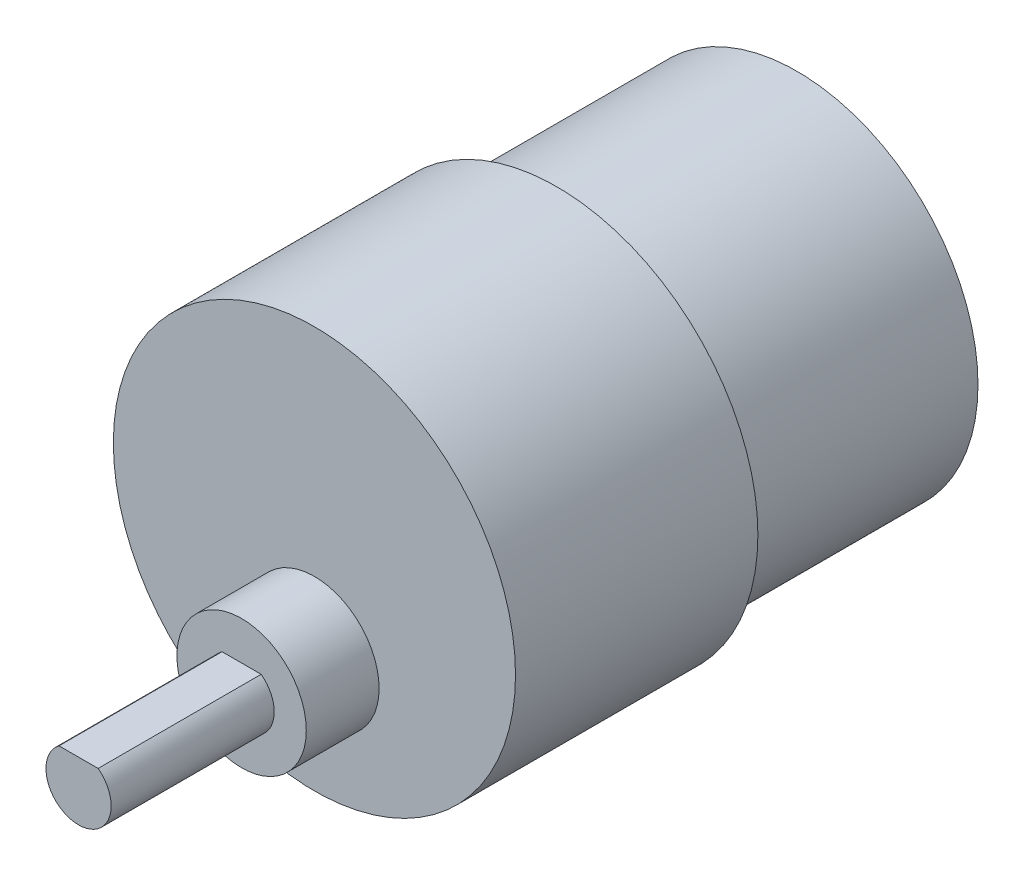
ISO-10303-21;
HEADER;
FILE_DESCRIPTION(('STEP AP214'),'2;1');
FILE_NAME('part.step','',(''),(''),'','','');
FILE_SCHEMA(('AUTOMOTIVE_DESIGN { 1 0 10303 214 1 1 1 1 }'));
ENDSEC;
DATA;
#1=APPLICATION_CONTEXT('core data for automotive mechanical design processes');
#2=APPLICATION_PROTOCOL_DEFINITION('international standard','automotive_design',2000,#1);
#3=PRODUCT_CONTEXT('',#1,'mechanical');
#4=PRODUCT('Part','Part','',(#3));
#5=PRODUCT_RELATED_PRODUCT_CATEGORY('part','',(#4));
#6=PRODUCT_DEFINITION_FORMATION('','',#4);
#7=PRODUCT_DEFINITION_CONTEXT('part definition',#1,'design');
#8=PRODUCT_DEFINITION('design','',#6,#7);
#9=PRODUCT_DEFINITION_SHAPE('','',#8);
#10=(LENGTH_UNIT() NAMED_UNIT(*) SI_UNIT(.MILLI.,.METRE.));
#11=(NAMED_UNIT(*) PLANE_ANGLE_UNIT() SI_UNIT($,.RADIAN.));
#12=(NAMED_UNIT(*) SI_UNIT($,.STERADIAN.) SOLID_ANGLE_UNIT());
#13=UNCERTAINTY_MEASURE_WITH_UNIT(LENGTH_MEASURE(1.E-05),#10,'distance_accuracy_value','');
#14=(GEOMETRIC_REPRESENTATION_CONTEXT(3) GLOBAL_UNCERTAINTY_ASSIGNED_CONTEXT((#13)) GLOBAL_UNIT_ASSIGNED_CONTEXT((#10,
#11,#12)) REPRESENTATION_CONTEXT('',''));
#15=CARTESIAN_POINT('',(0.,0.,0.));
#16=DIRECTION('',(0.,0.,1.));
#17=DIRECTION('',(1.,0.,0.));
#18=AXIS2_PLACEMENT_3D('',#15,#16,#17);
#19=CARTESIAN_POINT('',(0.,0.,22.1));
#20=DIRECTION('',(0.,0.,-1.));
#21=DIRECTION('',(-1.,0.,0.));
#22=AXIS2_PLACEMENT_3D('',#19,#20,#21);
#23=CYLINDRICAL_SURFACE('',#22,16.65);
#24=CARTESIAN_POINT('',(0.,0.,22.1));
#25=DIRECTION('',(0.,0.,1.));
#26=DIRECTION('',(1.,0.,0.));
#27=AXIS2_PLACEMENT_3D('',#24,#25,#26);
#28=CIRCLE('',#27,16.65);
#29=CARTESIAN_POINT('',(16.65,0.,22.1));
#30=VERTEX_POINT('',#29);
#31=EDGE_CURVE('E11',#30,#30,#28,.T.);
#32=ORIENTED_EDGE('',*,*,#31,.F.);
#33=EDGE_LOOP('',(#32));
#34=FACE_BOUND('',#33,.T.);
#35=CARTESIAN_POINT('',(0.,0.,0.));
#36=DIRECTION('',(0.,0.,1.));
#37=DIRECTION('',(1.,0.,0.));
#38=AXIS2_PLACEMENT_3D('',#35,#36,#37);
#39=CIRCLE('',#38,16.65);
#40=CARTESIAN_POINT('',(16.65,0.,0.));
#41=VERTEX_POINT('',#40);
#42=EDGE_CURVE('E46',#41,#41,#39,.T.);
#43=ORIENTED_EDGE('',*,*,#42,.T.);
#44=EDGE_LOOP('',(#43));
#45=FACE_BOUND('',#44,.T.);
#46=ADVANCED_FACE('F43',(#34,#45),#23,.T.);
#47=CARTESIAN_POINT('',(0.,0.,0.));
#48=DIRECTION('',(0.,0.,1.));
#49=DIRECTION('',(1.,0.,0.));
#50=AXIS2_PLACEMENT_3D('',#47,#48,#49);
#51=PLANE('',#50);
#52=ORIENTED_EDGE('',*,*,#42,.F.);
#53=EDGE_LOOP('',(#52));
#54=FACE_BOUND('',#53,.T.);
#55=ADVANCED_FACE('F131',(#54),#51,.F.);
#56=CARTESIAN_POINT('',(0.,0.,44.4));
#57=DIRECTION('',(0.,0.,-1.));
#58=DIRECTION('',(-1.,0.,0.));
#59=AXIS2_PLACEMENT_3D('',#56,#57,#58);
#60=CYLINDRICAL_SURFACE('',#59,18.5);
#61=CARTESIAN_POINT('',(0.,0.,44.4));
#62=DIRECTION('',(0.,0.,1.));
#63=DIRECTION('',(1.,0.,0.));
#64=AXIS2_PLACEMENT_3D('',#61,#62,#63);
#65=CIRCLE('',#64,18.5);
#66=CARTESIAN_POINT('',(18.5,0.,44.4));
#67=VERTEX_POINT('',#66);
#68=EDGE_CURVE('E104',#67,#67,#65,.T.);
#69=ORIENTED_EDGE('',*,*,#68,.F.);
#70=EDGE_LOOP('',(#69));
#71=FACE_BOUND('',#70,.T.);
#72=CARTESIAN_POINT('',(0.,0.,22.1));
#73=DIRECTION('',(0.,0.,1.));
#74=DIRECTION('',(1.,0.,0.));
#75=AXIS2_PLACEMENT_3D('',#72,#73,#74);
#76=CIRCLE('',#75,18.5);
#77=CARTESIAN_POINT('',(18.5,0.,22.1));
#78=VERTEX_POINT('',#77);
#79=EDGE_CURVE('E100',#78,#78,#76,.T.);
#80=ORIENTED_EDGE('',*,*,#79,.T.);
#81=EDGE_LOOP('',(#80));
#82=FACE_BOUND('',#81,.T.);
#83=ADVANCED_FACE('F113',(#71,#82),#60,.T.);
#84=CARTESIAN_POINT('',(0.,0.,44.4));
#85=DIRECTION('',(0.,0.,1.));
#86=DIRECTION('',(1.,0.,0.));
#87=AXIS2_PLACEMENT_3D('',#84,#85,#86);
#88=PLANE('',#87);
#89=CARTESIAN_POINT('',(0.,-7.35,44.4));
#90=DIRECTION('',(0.,0.,1.));
#91=DIRECTION('',(1.,0.,0.));
#92=AXIS2_PLACEMENT_3D('',#89,#90,#91);
#93=CIRCLE('',#92,5.95);
#94=CARTESIAN_POINT('',(5.95,-7.35,44.4));
#95=VERTEX_POINT('',#94);
#96=EDGE_CURVE('E92',#95,#95,#93,.T.);
#97=ORIENTED_EDGE('',*,*,#96,.F.);
#98=EDGE_LOOP('',(#97));
#99=FACE_BOUND('',#98,.T.);
#100=ORIENTED_EDGE('',*,*,#68,.T.);
#101=EDGE_LOOP('',(#100));
#102=FACE_BOUND('',#101,.T.);
#103=ADVANCED_FACE('F118',(#99,#102),#88,.T.);
#104=CARTESIAN_POINT('',(0.,0.,22.1));
#105=DIRECTION('',(0.,0.,1.));
#106=DIRECTION('',(1.,0.,0.));
#107=AXIS2_PLACEMENT_3D('',#104,#105,#106);
#108=PLANE('',#107);
#109=ORIENTED_EDGE('',*,*,#31,.T.);
#110=EDGE_LOOP('',(#109));
#111=FACE_BOUND('',#110,.T.);
#112=ORIENTED_EDGE('',*,*,#79,.F.);
#113=EDGE_LOOP('',(#112));
#114=FACE_BOUND('',#113,.T.);
#115=ADVANCED_FACE('F115',(#111,#114),#108,.F.);
#116=CARTESIAN_POINT('',(0.,-7.35,51.1));
#117=DIRECTION('',(0.,0.,-1.));
#118=DIRECTION('',(-1.,0.,0.));
#119=AXIS2_PLACEMENT_3D('',#116,#117,#118);
#120=CYLINDRICAL_SURFACE('',#119,5.95);
#121=CARTESIAN_POINT('',(0.,-7.35,51.1));
#122=DIRECTION('',(0.,0.,1.));
#123=DIRECTION('',(1.,0.,0.));
#124=AXIS2_PLACEMENT_3D('',#121,#122,#123);
#125=CIRCLE('',#124,5.95);
#126=CARTESIAN_POINT('',(5.95,-7.35,51.1));
#127=VERTEX_POINT('',#126);
#128=EDGE_CURVE('E96',#127,#127,#125,.T.);
#129=ORIENTED_EDGE('',*,*,#128,.F.);
#130=EDGE_LOOP('',(#129));
#131=FACE_BOUND('',#130,.T.);
#132=ORIENTED_EDGE('',*,*,#96,.T.);
#133=EDGE_LOOP('',(#132));
#134=FACE_BOUND('',#133,.T.);
#135=ADVANCED_FACE('F117',(#131,#134),#120,.T.);
#136=CARTESIAN_POINT('',(0.,-7.35,51.1));
#137=DIRECTION('',(0.,0.,1.));
#138=DIRECTION('',(1.,0.,0.));
#139=AXIS2_PLACEMENT_3D('',#136,#137,#138);
#140=PLANE('',#139);
#141=CARTESIAN_POINT('',(0.,-7.35,51.1));
#142=DIRECTION('',(0.,0.,1.));
#143=DIRECTION('',(1.,0.,0.));
#144=AXIS2_PLACEMENT_3D('',#141,#142,#143);
#145=CIRCLE('',#144,3.);
#146=CARTESIAN_POINT('',(-1.8,-4.95,51.1));
#147=VERTEX_POINT('',#146);
#148=CARTESIAN_POINT('',(1.8,-4.95,51.1));
#149=VERTEX_POINT('',#148);
#150=EDGE_CURVE('E70',#147,#149,#145,.T.);
#151=ORIENTED_EDGE('',*,*,#150,.F.);
#152=DIRECTION('',(-1.,0.,0.));
#153=VECTOR('',#152,1.);
#154=CARTESIAN_POINT('',(-1.8,-4.95,51.1));
#155=LINE('',#154,#153);
#156=EDGE_CURVE('E57',#149,#147,#155,.T.);
#157=ORIENTED_EDGE('',*,*,#156,.F.);
#158=EDGE_LOOP('',(#151,#157));
#159=FACE_BOUND('',#158,.T.);
#160=ORIENTED_EDGE('',*,*,#128,.T.);
#161=EDGE_LOOP('',(#160));
#162=FACE_BOUND('',#161,.T.);
#163=ADVANCED_FACE('F71',(#159,#162),#140,.T.);
#164=CARTESIAN_POINT('',(0.,-7.35,66.1));
#165=DIRECTION('',(0.,0.,-1.));
#166=DIRECTION('',(-1.,0.,0.));
#167=AXIS2_PLACEMENT_3D('',#164,#165,#166);
#168=CYLINDRICAL_SURFACE('',#167,3.);
#169=ORIENTED_EDGE('',*,*,#150,.T.);
#170=DIRECTION('',(0.,0.,-1.));
#171=VECTOR('',#170,1.);
#172=CARTESIAN_POINT('',(1.8,-4.95,66.1));
#173=LINE('',#172,#171);
#174=CARTESIAN_POINT('',(1.8,-4.95,66.1));
#175=VERTEX_POINT('',#174);
#176=EDGE_CURVE('E82',#175,#149,#173,.T.);
#177=ORIENTED_EDGE('',*,*,#176,.F.);
#178=CARTESIAN_POINT('',(0.,-7.35,66.1));
#179=DIRECTION('',(0.,0.,1.));
#180=DIRECTION('',(1.,0.,0.));
#181=AXIS2_PLACEMENT_3D('',#178,#179,#180);
#182=CIRCLE('',#181,3.);
#183=CARTESIAN_POINT('',(-1.8,-4.95,66.1));
#184=VERTEX_POINT('',#183);
#185=EDGE_CURVE('E84',#184,#175,#182,.T.);
#186=ORIENTED_EDGE('',*,*,#185,.F.);
#187=DIRECTION('',(0.,0.,-1.));
#188=VECTOR('',#187,1.);
#189=CARTESIAN_POINT('',(-1.8,-4.95,66.1));
#190=LINE('',#189,#188);
#191=EDGE_CURVE('E80',#184,#147,#190,.T.);
#192=ORIENTED_EDGE('',*,*,#191,.T.);
#193=EDGE_LOOP('',(#169,#177,#186,#192));
#194=FACE_BOUND('',#193,.T.);
#195=ADVANCED_FACE('F86',(#194),#168,.T.);
#196=CARTESIAN_POINT('',(-1.8,-4.95,66.1));
#197=DIRECTION('',(0.,-1.,0.));
#198=DIRECTION('',(0.,0.,-1.));
#199=AXIS2_PLACEMENT_3D('',#196,#197,#198);
#200=PLANE('',#199);
#201=ORIENTED_EDGE('',*,*,#156,.T.);
#202=ORIENTED_EDGE('',*,*,#191,.F.);
#203=DIRECTION('',(-1.,0.,0.));
#204=VECTOR('',#203,1.);
#205=CARTESIAN_POINT('',(-1.8,-4.95,66.1));
#206=LINE('',#205,#204);
#207=EDGE_CURVE('E65',#175,#184,#206,.T.);
#208=ORIENTED_EDGE('',*,*,#207,.F.);
#209=ORIENTED_EDGE('',*,*,#176,.T.);
#210=EDGE_LOOP('',(#201,#202,#208,#209));
#211=FACE_BOUND('',#210,.T.);
#212=ADVANCED_FACE('F79',(#211),#200,.F.);
#213=CARTESIAN_POINT('',(0.,-7.35,66.1));
#214=DIRECTION('',(0.,0.,1.));
#215=DIRECTION('',(1.,0.,0.));
#216=AXIS2_PLACEMENT_3D('',#213,#214,#215);
#217=PLANE('',#216);
#218=ORIENTED_EDGE('',*,*,#185,.T.);
#219=ORIENTED_EDGE('',*,*,#207,.T.);
#220=EDGE_LOOP('',(#218,#219));
#221=FACE_BOUND('',#220,.T.);
#222=ADVANCED_FACE('F190',(#221),#217,.T.);
#223=CLOSED_SHELL('',(#46,#55,#83,#103,#115,#135,#163,#195,#212,#222));
#224=MANIFOLD_SOLID_BREP('B2',#223);
#225=ADVANCED_BREP_SHAPE_REPRESENTATION('',(#18,#224),#14);
#226=SHAPE_DEFINITION_REPRESENTATION(#9,#225);
ENDSEC;
END-ISO-10303-21;
